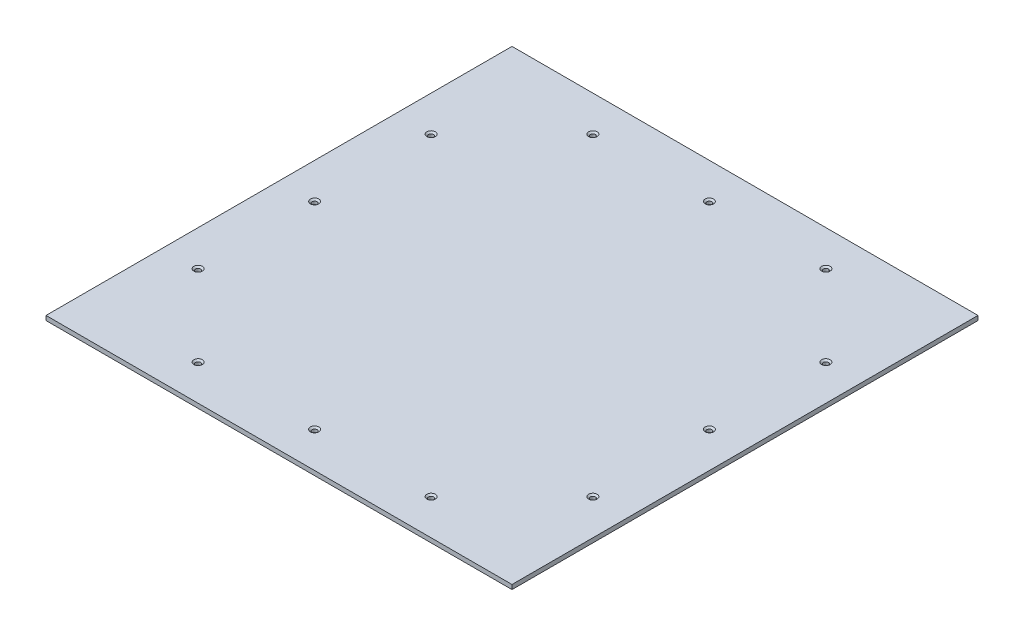
ISO-10303-21;
HEADER;
FILE_DESCRIPTION(('STEP AP214'),'2;1');
FILE_NAME('part.step','',(''),(''),'','','');
FILE_SCHEMA(('AUTOMOTIVE_DESIGN { 1 0 10303 214 1 1 1 1 }'));
ENDSEC;
DATA;
#1=APPLICATION_CONTEXT('core data for automotive mechanical design processes');
#2=APPLICATION_PROTOCOL_DEFINITION('international standard','automotive_design',2000,#1);
#3=PRODUCT_CONTEXT('',#1,'mechanical');
#4=PRODUCT('Part','Part','',(#3));
#5=PRODUCT_RELATED_PRODUCT_CATEGORY('part','',(#4));
#6=PRODUCT_DEFINITION_FORMATION('','',#4);
#7=PRODUCT_DEFINITION_CONTEXT('part definition',#1,'design');
#8=PRODUCT_DEFINITION('design','',#6,#7);
#9=PRODUCT_DEFINITION_SHAPE('','',#8);
#10=(LENGTH_UNIT() NAMED_UNIT(*) SI_UNIT(.MILLI.,.METRE.));
#11=(NAMED_UNIT(*) PLANE_ANGLE_UNIT() SI_UNIT($,.RADIAN.));
#12=(NAMED_UNIT(*) SI_UNIT($,.STERADIAN.) SOLID_ANGLE_UNIT());
#13=UNCERTAINTY_MEASURE_WITH_UNIT(LENGTH_MEASURE(1.E-05),#10,'distance_accuracy_value','');
#14=(GEOMETRIC_REPRESENTATION_CONTEXT(3) GLOBAL_UNCERTAINTY_ASSIGNED_CONTEXT((#13)) GLOBAL_UNIT_ASSIGNED_CONTEXT((#10,
#11,#12)) REPRESENTATION_CONTEXT('',''));
#15=CARTESIAN_POINT('',(0.,0.,0.));
#16=DIRECTION('',(0.,0.,1.));
#17=DIRECTION('',(1.,0.,0.));
#18=AXIS2_PLACEMENT_3D('',#15,#16,#17);
#19=CARTESIAN_POINT('',(83.101307,94.213807,83.101307));
#20=DIRECTION('',(1.,0.,0.));
#21=DIRECTION('',(0.,0.,1.));
#22=AXIS2_PLACEMENT_3D('',#19,#20,#21);
#23=PLANE('',#22);
#24=DIRECTION('',(0.,0.,1.));
#25=VECTOR('',#24,1.);
#26=CARTESIAN_POINT('',(83.101307,92.626307,83.101307));
#27=LINE('',#26,#25);
#28=CARTESIAN_POINT('',(83.101307,92.626307,-83.101307));
#29=VERTEX_POINT('',#28);
#30=CARTESIAN_POINT('',(83.101307,92.626307,83.101307));
#31=VERTEX_POINT('',#30);
#32=EDGE_CURVE('E81',#29,#31,#27,.T.);
#33=ORIENTED_EDGE('',*,*,#32,.F.);
#34=DIRECTION('',(0.,-1.,0.));
#35=VECTOR('',#34,1.);
#36=CARTESIAN_POINT('',(83.101307,94.213807,-83.101307));
#37=LINE('',#36,#35);
#38=CARTESIAN_POINT('',(83.101307,94.213807,-83.101307));
#39=VERTEX_POINT('',#38);
#40=EDGE_CURVE('E11',#39,#29,#37,.T.);
#41=ORIENTED_EDGE('',*,*,#40,.F.);
#42=DIRECTION('',(0.,0.,1.));
#43=VECTOR('',#42,1.);
#44=CARTESIAN_POINT('',(83.101307,94.213807,83.101307));
#45=LINE('',#44,#43);
#46=CARTESIAN_POINT('',(83.101307,94.213807,83.101307));
#47=VERTEX_POINT('',#46);
#48=EDGE_CURVE('E74',#39,#47,#45,.T.);
#49=ORIENTED_EDGE('',*,*,#48,.T.);
#50=DIRECTION('',(0.,-1.,0.));
#51=VECTOR('',#50,1.);
#52=CARTESIAN_POINT('',(83.101307,94.213807,83.101307));
#53=LINE('',#52,#51);
#54=EDGE_CURVE('E19',#47,#31,#53,.T.);
#55=ORIENTED_EDGE('',*,*,#54,.T.);
#56=EDGE_LOOP('',(#33,#41,#49,#55));
#57=FACE_BOUND('',#56,.T.);
#58=ADVANCED_FACE('F16',(#57),#23,.T.);
#59=CARTESIAN_POINT('',(83.101307,94.213807,-83.101307));
#60=DIRECTION('',(0.,0.,-1.));
#61=DIRECTION('',(1.,0.,0.));
#62=AXIS2_PLACEMENT_3D('',#59,#60,#61);
#63=PLANE('',#62);
#64=DIRECTION('',(1.,0.,0.));
#65=VECTOR('',#64,1.);
#66=CARTESIAN_POINT('',(83.101307,92.626307,-83.101307));
#67=LINE('',#66,#65);
#68=CARTESIAN_POINT('',(-83.101307,92.626307,-83.101307));
#69=VERTEX_POINT('',#68);
#70=EDGE_CURVE('E76',#69,#29,#67,.T.);
#71=ORIENTED_EDGE('',*,*,#70,.F.);
#72=DIRECTION('',(0.,-1.,0.));
#73=VECTOR('',#72,1.);
#74=CARTESIAN_POINT('',(-83.101307,94.213807,-83.101307));
#75=LINE('',#74,#73);
#76=CARTESIAN_POINT('',(-83.101307,94.213807,-83.101307));
#77=VERTEX_POINT('',#76);
#78=EDGE_CURVE('E25',#77,#69,#75,.T.);
#79=ORIENTED_EDGE('',*,*,#78,.F.);
#80=DIRECTION('',(1.,0.,0.));
#81=VECTOR('',#80,1.);
#82=CARTESIAN_POINT('',(83.101307,94.213807,-83.101307));
#83=LINE('',#82,#81);
#84=EDGE_CURVE('E71',#77,#39,#83,.T.);
#85=ORIENTED_EDGE('',*,*,#84,.T.);
#86=ORIENTED_EDGE('',*,*,#40,.T.);
#87=EDGE_LOOP('',(#71,#79,#85,#86));
#88=FACE_BOUND('',#87,.T.);
#89=ADVANCED_FACE('F92',(#88),#63,.T.);
#90=CARTESIAN_POINT('',(-83.101307,94.213807,83.101307));
#91=DIRECTION('',(-1.,0.,0.));
#92=DIRECTION('',(0.,0.,-1.));
#93=AXIS2_PLACEMENT_3D('',#90,#91,#92);
#94=PLANE('',#93);
#95=DIRECTION('',(0.,0.,-1.));
#96=VECTOR('',#95,1.);
#97=CARTESIAN_POINT('',(-83.101307,92.626307,83.101307));
#98=LINE('',#97,#96);
#99=CARTESIAN_POINT('',(-83.101307,92.626307,83.101307));
#100=VERTEX_POINT('',#99);
#101=EDGE_CURVE('E66',#100,#69,#98,.T.);
#102=ORIENTED_EDGE('',*,*,#101,.F.);
#103=DIRECTION('',(0.,-1.,0.));
#104=VECTOR('',#103,1.);
#105=CARTESIAN_POINT('',(-83.101307,94.213807,83.101307));
#106=LINE('',#105,#104);
#107=CARTESIAN_POINT('',(-83.101307,94.213807,83.101307));
#108=VERTEX_POINT('',#107);
#109=EDGE_CURVE('E61',#108,#100,#106,.T.);
#110=ORIENTED_EDGE('',*,*,#109,.F.);
#111=DIRECTION('',(0.,0.,-1.));
#112=VECTOR('',#111,1.);
#113=CARTESIAN_POINT('',(-83.101307,94.213807,83.101307));
#114=LINE('',#113,#112);
#115=EDGE_CURVE('E64',#108,#77,#114,.T.);
#116=ORIENTED_EDGE('',*,*,#115,.T.);
#117=ORIENTED_EDGE('',*,*,#78,.T.);
#118=EDGE_LOOP('',(#102,#110,#116,#117));
#119=FACE_BOUND('',#118,.T.);
#120=ADVANCED_FACE('F63',(#119),#94,.T.);
#121=CARTESIAN_POINT('',(83.101307,94.213807,83.101307));
#122=DIRECTION('',(0.,0.,1.));
#123=DIRECTION('',(-1.,0.,0.));
#124=AXIS2_PLACEMENT_3D('',#121,#122,#123);
#125=PLANE('',#124);
#126=DIRECTION('',(-1.,0.,0.));
#127=VECTOR('',#126,1.);
#128=CARTESIAN_POINT('',(83.101307,92.626307,83.101307));
#129=LINE('',#128,#127);
#130=EDGE_CURVE('E84',#31,#100,#129,.T.);
#131=ORIENTED_EDGE('',*,*,#130,.F.);
#132=ORIENTED_EDGE('',*,*,#54,.F.);
#133=DIRECTION('',(-1.,0.,0.));
#134=VECTOR('',#133,1.);
#135=CARTESIAN_POINT('',(83.101307,94.213807,83.101307));
#136=LINE('',#135,#134);
#137=EDGE_CURVE('E70',#47,#108,#136,.T.);
#138=ORIENTED_EDGE('',*,*,#137,.T.);
#139=ORIENTED_EDGE('',*,*,#109,.T.);
#140=EDGE_LOOP('',(#131,#132,#138,#139));
#141=FACE_BOUND('',#140,.T.);
#142=ADVANCED_FACE('F73',(#141),#125,.T.);
#143=CARTESIAN_POINT('',(83.101307,94.213807,-83.101307));
#144=DIRECTION('',(0.,1.,0.));
#145=DIRECTION('',(0.,0.,-1.));
#146=AXIS2_PLACEMENT_3D('',#143,#144,#145);
#147=PLANE('',#146);
#148=CARTESIAN_POINT('',(-70.4013070000004,94.213807,41.5506534999993));
#149=DIRECTION('',(0.,1.,0.));
#150=DIRECTION('',(0.,0.,-1.));
#151=AXIS2_PLACEMENT_3D('',#148,#149,#150);
#152=CIRCLE('',#151,1.51130000000001);
#153=CARTESIAN_POINT('',(-70.4013070000004,94.213807,40.0393534999993));
#154=VERTEX_POINT('',#153);
#155=EDGE_CURVE('E221',#154,#154,#152,.T.);
#156=ORIENTED_EDGE('',*,*,#155,.F.);
#157=EDGE_LOOP('',(#156));
#158=FACE_BOUND('',#157,.T.);
#159=CARTESIAN_POINT('',(-70.401307,94.213807,-7.26677097100821E-13));
#160=DIRECTION('',(0.,1.,0.));
#161=DIRECTION('',(0.,0.,-1.));
#162=AXIS2_PLACEMENT_3D('',#159,#160,#161);
#163=CIRCLE('',#162,1.51129999999999);
#164=CARTESIAN_POINT('',(-70.401307,94.213807,-1.51130000000072));
#165=VERTEX_POINT('',#164);
#166=EDGE_CURVE('E228',#165,#165,#163,.T.);
#167=ORIENTED_EDGE('',*,*,#166,.F.);
#168=EDGE_LOOP('',(#167));
#169=FACE_BOUND('',#168,.T.);
#170=CARTESIAN_POINT('',(-70.4013069999996,94.213807,-41.5506535000007));
#171=DIRECTION('',(0.,1.,0.));
#172=DIRECTION('',(0.,0.,-1.));
#173=AXIS2_PLACEMENT_3D('',#170,#171,#172);
#174=CIRCLE('',#173,1.51129999999999);
#175=CARTESIAN_POINT('',(-70.4013069999996,94.213807,-43.0619535000007));
#176=VERTEX_POINT('',#175);
#177=EDGE_CURVE('E237',#176,#176,#174,.T.);
#178=ORIENTED_EDGE('',*,*,#177,.F.);
#179=EDGE_LOOP('',(#178));
#180=FACE_BOUND('',#179,.T.);
#181=CARTESIAN_POINT('',(41.5506534999995,94.213807,70.4013070000003));
#182=DIRECTION('',(0.,1.,0.));
#183=DIRECTION('',(0.,0.,-1.));
#184=AXIS2_PLACEMENT_3D('',#181,#182,#183);
#185=CIRCLE('',#184,1.5113);
#186=CARTESIAN_POINT('',(41.5506534999995,94.213807,68.8900070000003));
#187=VERTEX_POINT('',#186);
#188=EDGE_CURVE('E246',#187,#187,#185,.T.);
#189=ORIENTED_EDGE('',*,*,#188,.F.);
#190=EDGE_LOOP('',(#189));
#191=FACE_BOUND('',#190,.T.);
#192=CARTESIAN_POINT('',(-4.80872105109967E-13,94.213807,70.401307));
#193=DIRECTION('',(0.,1.,0.));
#194=DIRECTION('',(0.,0.,-1.));
#195=AXIS2_PLACEMENT_3D('',#192,#193,#194);
#196=CIRCLE('',#195,1.5113);
#197=CARTESIAN_POINT('',(-4.80872105109967E-13,94.213807,68.890007));
#198=VERTEX_POINT('',#197);
#199=EDGE_CURVE('E255',#198,#198,#196,.T.);
#200=ORIENTED_EDGE('',*,*,#199,.F.);
#201=EDGE_LOOP('',(#200));
#202=FACE_BOUND('',#201,.T.);
#203=CARTESIAN_POINT('',(-41.5506535000005,94.213807,70.4013069999997));
#204=DIRECTION('',(0.,1.,0.));
#205=DIRECTION('',(0.,0.,-1.));
#206=AXIS2_PLACEMENT_3D('',#203,#204,#205);
#207=CIRCLE('',#206,1.5113);
#208=CARTESIAN_POINT('',(-41.5506535000005,94.213807,68.8900069999997));
#209=VERTEX_POINT('',#208);
#210=EDGE_CURVE('E264',#209,#209,#207,.T.);
#211=ORIENTED_EDGE('',*,*,#210,.F.);
#212=EDGE_LOOP('',(#211));
#213=FACE_BOUND('',#212,.T.);
#214=CARTESIAN_POINT('',(70.4013070000001,94.213807,-41.5506534999998));
#215=DIRECTION('',(0.,1.,0.));
#216=DIRECTION('',(0.,0.,-1.));
#217=AXIS2_PLACEMENT_3D('',#214,#215,#216);
#218=CIRCLE('',#217,1.51129999999999);
#219=CARTESIAN_POINT('',(70.4013070000001,94.213807,-43.0619534999998));
#220=VERTEX_POINT('',#219);
#221=EDGE_CURVE('E273',#220,#220,#218,.T.);
#222=ORIENTED_EDGE('',*,*,#221,.F.);
#223=EDGE_LOOP('',(#222));
#224=FACE_BOUND('',#223,.T.);
#225=CARTESIAN_POINT('',(70.401307,94.213807,2.35067113119114E-13));
#226=DIRECTION('',(0.,1.,0.));
#227=DIRECTION('',(0.,0.,-1.));
#228=AXIS2_PLACEMENT_3D('',#225,#226,#227);
#229=CIRCLE('',#228,1.51129999999999);
#230=CARTESIAN_POINT('',(70.401307,94.213807,-1.51129999999976));
#231=VERTEX_POINT('',#230);
#232=EDGE_CURVE('E282',#231,#231,#229,.T.);
#233=ORIENTED_EDGE('',*,*,#232,.F.);
#234=EDGE_LOOP('',(#233));
#235=FACE_BOUND('',#234,.T.);
#236=CARTESIAN_POINT('',(70.4013069999999,94.213807,41.5506535000003));
#237=DIRECTION('',(0.,1.,0.));
#238=DIRECTION('',(0.,0.,-1.));
#239=AXIS2_PLACEMENT_3D('',#236,#237,#238);
#240=CIRCLE('',#239,1.51130000000001);
#241=CARTESIAN_POINT('',(70.4013069999999,94.213807,40.0393535000002));
#242=VERTEX_POINT('',#241);
#243=EDGE_CURVE('E291',#242,#242,#240,.T.);
#244=ORIENTED_EDGE('',*,*,#243,.F.);
#245=EDGE_LOOP('',(#244));
#246=FACE_BOUND('',#245,.T.);
#247=CARTESIAN_POINT('',(-41.5506535,94.213807,-70.401307));
#248=DIRECTION('',(0.,1.,0.));
#249=DIRECTION('',(0.,0.,-1.));
#250=AXIS2_PLACEMENT_3D('',#247,#248,#249);
#251=CIRCLE('',#250,1.5113);
#252=CARTESIAN_POINT('',(-41.5506535,94.213807,-71.912607));
#253=VERTEX_POINT('',#252);
#254=EDGE_CURVE('E300',#253,#253,#251,.T.);
#255=ORIENTED_EDGE('',*,*,#254,.F.);
#256=EDGE_LOOP('',(#255));
#257=FACE_BOUND('',#256,.T.);
#258=CARTESIAN_POINT('',(0.,94.213807,-70.401307));
#259=DIRECTION('',(0.,1.,0.));
#260=DIRECTION('',(0.,0.,-1.));
#261=AXIS2_PLACEMENT_3D('',#258,#259,#260);
#262=CIRCLE('',#261,1.5113);
#263=CARTESIAN_POINT('',(0.,94.213807,-71.912607));
#264=VERTEX_POINT('',#263);
#265=EDGE_CURVE('E309',#264,#264,#262,.T.);
#266=ORIENTED_EDGE('',*,*,#265,.F.);
#267=EDGE_LOOP('',(#266));
#268=FACE_BOUND('',#267,.T.);
#269=CARTESIAN_POINT('',(41.5506535,94.213807,-70.401307));
#270=DIRECTION('',(0.,1.,0.));
#271=DIRECTION('',(0.,0.,-1.));
#272=AXIS2_PLACEMENT_3D('',#269,#270,#271);
#273=CIRCLE('',#272,1.5113);
#274=CARTESIAN_POINT('',(41.5506535,94.213807,-71.912607));
#275=VERTEX_POINT('',#274);
#276=EDGE_CURVE('E318',#275,#275,#273,.T.);
#277=ORIENTED_EDGE('',*,*,#276,.F.);
#278=EDGE_LOOP('',(#277));
#279=FACE_BOUND('',#278,.T.);
#280=ORIENTED_EDGE('',*,*,#48,.F.);
#281=ORIENTED_EDGE('',*,*,#84,.F.);
#282=ORIENTED_EDGE('',*,*,#115,.F.);
#283=ORIENTED_EDGE('',*,*,#137,.F.);
#284=EDGE_LOOP('',(#280,#281,#282,#283));
#285=FACE_BOUND('',#284,.T.);
#286=ADVANCED_FACE('F69',(#158,#169,#180,#191,#202,#213,#224,#235,#246,#257,#268,#279,#285),
#147,.T.);
#287=CARTESIAN_POINT('',(83.101307,92.626307,-83.101307));
#288=DIRECTION('',(0.,1.,0.));
#289=DIRECTION('',(0.,0.,-1.));
#290=AXIS2_PLACEMENT_3D('',#287,#288,#289);
#291=PLANE('',#290);
#292=CARTESIAN_POINT('',(-70.4013070000004,92.626307,41.5506534999993));
#293=DIRECTION('',(0.,1.,0.));
#294=DIRECTION('',(0.,0.,-1.));
#295=AXIS2_PLACEMENT_3D('',#292,#293,#294);
#296=CIRCLE('',#295,0.889000000000001);
#297=CARTESIAN_POINT('',(-70.4013070000004,92.626307,40.6616534999993));
#298=VERTEX_POINT('',#297);
#299=EDGE_CURVE('E223',#298,#298,#296,.T.);
#300=ORIENTED_EDGE('',*,*,#299,.T.);
#301=EDGE_LOOP('',(#300));
#302=FACE_BOUND('',#301,.T.);
#303=CARTESIAN_POINT('',(-70.401307,92.626307,-7.26677097100821E-13));
#304=DIRECTION('',(0.,1.,0.));
#305=DIRECTION('',(0.,0.,-1.));
#306=AXIS2_PLACEMENT_3D('',#303,#304,#305);
#307=CIRCLE('',#306,0.889000000000001);
#308=CARTESIAN_POINT('',(-70.401307,92.626307,-0.889000000000728));
#309=VERTEX_POINT('',#308);
#310=EDGE_CURVE('E234',#309,#309,#307,.T.);
#311=ORIENTED_EDGE('',*,*,#310,.T.);
#312=EDGE_LOOP('',(#311));
#313=FACE_BOUND('',#312,.T.);
#314=CARTESIAN_POINT('',(-70.4013069999996,92.626307,-41.5506535000007));
#315=DIRECTION('',(0.,1.,0.));
#316=DIRECTION('',(0.,0.,-1.));
#317=AXIS2_PLACEMENT_3D('',#314,#315,#316);
#318=CIRCLE('',#317,0.889000000000001);
#319=CARTESIAN_POINT('',(-70.4013069999996,92.626307,-42.4396535000007));
#320=VERTEX_POINT('',#319);
#321=EDGE_CURVE('E243',#320,#320,#318,.T.);
#322=ORIENTED_EDGE('',*,*,#321,.T.);
#323=EDGE_LOOP('',(#322));
#324=FACE_BOUND('',#323,.T.);
#325=CARTESIAN_POINT('',(41.5506534999995,92.626307,70.4013070000003));
#326=DIRECTION('',(0.,1.,0.));
#327=DIRECTION('',(0.,0.,-1.));
#328=AXIS2_PLACEMENT_3D('',#325,#326,#327);
#329=CIRCLE('',#328,0.889000000000001);
#330=CARTESIAN_POINT('',(41.5506534999995,92.626307,69.5123070000003));
#331=VERTEX_POINT('',#330);
#332=EDGE_CURVE('E252',#331,#331,#329,.T.);
#333=ORIENTED_EDGE('',*,*,#332,.T.);
#334=EDGE_LOOP('',(#333));
#335=FACE_BOUND('',#334,.T.);
#336=CARTESIAN_POINT('',(-4.80872105109967E-13,92.626307,70.401307));
#337=DIRECTION('',(0.,1.,0.));
#338=DIRECTION('',(0.,0.,-1.));
#339=AXIS2_PLACEMENT_3D('',#336,#337,#338);
#340=CIRCLE('',#339,0.889);
#341=CARTESIAN_POINT('',(-4.80872105109967E-13,92.626307,69.512307));
#342=VERTEX_POINT('',#341);
#343=EDGE_CURVE('E261',#342,#342,#340,.T.);
#344=ORIENTED_EDGE('',*,*,#343,.T.);
#345=EDGE_LOOP('',(#344));
#346=FACE_BOUND('',#345,.T.);
#347=CARTESIAN_POINT('',(-41.5506535000005,92.626307,70.4013069999997));
#348=DIRECTION('',(0.,1.,0.));
#349=DIRECTION('',(0.,0.,-1.));
#350=AXIS2_PLACEMENT_3D('',#347,#348,#349);
#351=CIRCLE('',#350,0.889000000000001);
#352=CARTESIAN_POINT('',(-41.5506535000005,92.626307,69.5123069999997));
#353=VERTEX_POINT('',#352);
#354=EDGE_CURVE('E270',#353,#353,#351,.T.);
#355=ORIENTED_EDGE('',*,*,#354,.T.);
#356=EDGE_LOOP('',(#355));
#357=FACE_BOUND('',#356,.T.);
#358=CARTESIAN_POINT('',(70.4013070000001,92.626307,-41.5506534999998));
#359=DIRECTION('',(0.,1.,0.));
#360=DIRECTION('',(0.,0.,-1.));
#361=AXIS2_PLACEMENT_3D('',#358,#359,#360);
#362=CIRCLE('',#361,0.889000000000001);
#363=CARTESIAN_POINT('',(70.4013070000001,92.626307,-42.4396534999998));
#364=VERTEX_POINT('',#363);
#365=EDGE_CURVE('E279',#364,#364,#362,.T.);
#366=ORIENTED_EDGE('',*,*,#365,.T.);
#367=EDGE_LOOP('',(#366));
#368=FACE_BOUND('',#367,.T.);
#369=CARTESIAN_POINT('',(70.401307,92.626307,2.35067113119114E-13));
#370=DIRECTION('',(0.,1.,0.));
#371=DIRECTION('',(0.,0.,-1.));
#372=AXIS2_PLACEMENT_3D('',#369,#370,#371);
#373=CIRCLE('',#372,0.889000000000001);
#374=CARTESIAN_POINT('',(70.401307,92.626307,-0.888999999999766));
#375=VERTEX_POINT('',#374);
#376=EDGE_CURVE('E288',#375,#375,#373,.T.);
#377=ORIENTED_EDGE('',*,*,#376,.T.);
#378=EDGE_LOOP('',(#377));
#379=FACE_BOUND('',#378,.T.);
#380=CARTESIAN_POINT('',(70.4013069999999,92.626307,41.5506535000003));
#381=DIRECTION('',(0.,1.,0.));
#382=DIRECTION('',(0.,0.,-1.));
#383=AXIS2_PLACEMENT_3D('',#380,#381,#382);
#384=CIRCLE('',#383,0.889000000000001);
#385=CARTESIAN_POINT('',(70.4013069999999,92.626307,40.6616535000002));
#386=VERTEX_POINT('',#385);
#387=EDGE_CURVE('E297',#386,#386,#384,.T.);
#388=ORIENTED_EDGE('',*,*,#387,.T.);
#389=EDGE_LOOP('',(#388));
#390=FACE_BOUND('',#389,.T.);
#391=CARTESIAN_POINT('',(-41.5506535,92.626307,-70.401307));
#392=DIRECTION('',(0.,1.,0.));
#393=DIRECTION('',(0.,0.,-1.));
#394=AXIS2_PLACEMENT_3D('',#391,#392,#393);
#395=CIRCLE('',#394,0.889000000000001);
#396=CARTESIAN_POINT('',(-41.5506535,92.626307,-71.290307));
#397=VERTEX_POINT('',#396);
#398=EDGE_CURVE('E306',#397,#397,#395,.T.);
#399=ORIENTED_EDGE('',*,*,#398,.T.);
#400=EDGE_LOOP('',(#399));
#401=FACE_BOUND('',#400,.T.);
#402=CARTESIAN_POINT('',(0.,92.626307,-70.401307));
#403=DIRECTION('',(0.,1.,0.));
#404=DIRECTION('',(0.,0.,-1.));
#405=AXIS2_PLACEMENT_3D('',#402,#403,#404);
#406=CIRCLE('',#405,0.889);
#407=CARTESIAN_POINT('',(0.,92.626307,-71.290307));
#408=VERTEX_POINT('',#407);
#409=EDGE_CURVE('E315',#408,#408,#406,.T.);
#410=ORIENTED_EDGE('',*,*,#409,.T.);
#411=EDGE_LOOP('',(#410));
#412=FACE_BOUND('',#411,.T.);
#413=CARTESIAN_POINT('',(41.5506535,92.626307,-70.401307));
#414=DIRECTION('',(0.,1.,0.));
#415=DIRECTION('',(0.,0.,-1.));
#416=AXIS2_PLACEMENT_3D('',#413,#414,#415);
#417=CIRCLE('',#416,0.889000000000001);
#418=CARTESIAN_POINT('',(41.5506535,92.626307,-71.290307));
#419=VERTEX_POINT('',#418);
#420=EDGE_CURVE('E85',#419,#419,#417,.T.);
#421=ORIENTED_EDGE('',*,*,#420,.T.);
#422=EDGE_LOOP('',(#421));
#423=FACE_BOUND('',#422,.T.);
#424=ORIENTED_EDGE('',*,*,#32,.T.);
#425=ORIENTED_EDGE('',*,*,#130,.T.);
#426=ORIENTED_EDGE('',*,*,#101,.T.);
#427=ORIENTED_EDGE('',*,*,#70,.T.);
#428=EDGE_LOOP('',(#424,#425,#426,#427));
#429=FACE_BOUND('',#428,.T.);
#430=ADVANCED_FACE('F91',(#302,#313,#324,#335,#346,#357,#368,#379,#390,#401,#412,#423,#429),
#291,.F.);
#431=CARTESIAN_POINT('',(41.5506535,94.213807,-70.401307));
#432=DIRECTION('',(0.,1.,0.));
#433=DIRECTION('',(0.,0.,-1.));
#434=AXIS2_PLACEMENT_3D('',#431,#432,#433);
#435=CYLINDRICAL_SURFACE('',#434,0.888999999999997);
#436=ORIENTED_EDGE('',*,*,#420,.F.);
#437=EDGE_LOOP('',(#436));
#438=FACE_BOUND('',#437,.T.);
#439=CARTESIAN_POINT('',(41.5506535,93.6916352995184,-70.401307));
#440=DIRECTION('',(0.,1.,0.));
#441=DIRECTION('',(0.,0.,-1.));
#442=AXIS2_PLACEMENT_3D('',#439,#440,#441);
#443=CIRCLE('',#442,0.888999999999994);
#444=CARTESIAN_POINT('',(41.5506535,93.6916352995184,-71.290307));
#445=VERTEX_POINT('',#444);
#446=EDGE_CURVE('E321',#445,#445,#443,.T.);
#447=ORIENTED_EDGE('',*,*,#446,.T.);
#448=EDGE_LOOP('',(#447));
#449=FACE_BOUND('',#448,.T.);
#450=ADVANCED_FACE('F114',(#438,#449),#435,.F.);
#451=CARTESIAN_POINT('',(41.5506535,94.213807,-70.401307));
#452=DIRECTION('',(0.,1.,0.));
#453=DIRECTION('',(0.,0.,-1.));
#454=AXIS2_PLACEMENT_3D('',#451,#452,#453);
#455=CONICAL_SURFACE('',#454,1.5113,0.872664625997172);
#456=ORIENTED_EDGE('',*,*,#446,.F.);
#457=EDGE_LOOP('',(#456));
#458=FACE_BOUND('',#457,.T.);
#459=ORIENTED_EDGE('',*,*,#276,.T.);
#460=EDGE_LOOP('',(#459));
#461=FACE_BOUND('',#460,.T.);
#462=ADVANCED_FACE('F121',(#458,#461),#455,.F.);
#463=CARTESIAN_POINT('',(0.,94.213807,-70.401307));
#464=DIRECTION('',(0.,1.,0.));
#465=DIRECTION('',(0.,0.,-1.));
#466=AXIS2_PLACEMENT_3D('',#463,#464,#465);
#467=CYLINDRICAL_SURFACE('',#466,0.888999999999998);
#468=ORIENTED_EDGE('',*,*,#409,.F.);
#469=EDGE_LOOP('',(#468));
#470=FACE_BOUND('',#469,.T.);
#471=CARTESIAN_POINT('',(0.,93.6916352995184,-70.401307));
#472=DIRECTION('',(0.,1.,0.));
#473=DIRECTION('',(0.,0.,-1.));
#474=AXIS2_PLACEMENT_3D('',#471,#472,#473);
#475=CIRCLE('',#474,0.888999999999997);
#476=CARTESIAN_POINT('',(0.,93.6916352995184,-71.290307));
#477=VERTEX_POINT('',#476);
#478=EDGE_CURVE('E312',#477,#477,#475,.T.);
#479=ORIENTED_EDGE('',*,*,#478,.T.);
#480=EDGE_LOOP('',(#479));
#481=FACE_BOUND('',#480,.T.);
#482=ADVANCED_FACE('F125',(#470,#481),#467,.F.);
#483=CARTESIAN_POINT('',(0.,94.213807,-70.401307));
#484=DIRECTION('',(0.,1.,0.));
#485=DIRECTION('',(0.,0.,-1.));
#486=AXIS2_PLACEMENT_3D('',#483,#484,#485);
#487=CONICAL_SURFACE('',#486,1.5113,0.87266462599717);
#488=ORIENTED_EDGE('',*,*,#478,.F.);
#489=EDGE_LOOP('',(#488));
#490=FACE_BOUND('',#489,.T.);
#491=ORIENTED_EDGE('',*,*,#265,.T.);
#492=EDGE_LOOP('',(#491));
#493=FACE_BOUND('',#492,.T.);
#494=ADVANCED_FACE('F129',(#490,#493),#487,.F.);
#495=CARTESIAN_POINT('',(-41.5506535,94.213807,-70.401307));
#496=DIRECTION('',(0.,1.,0.));
#497=DIRECTION('',(0.,0.,-1.));
#498=AXIS2_PLACEMENT_3D('',#495,#496,#497);
#499=CYLINDRICAL_SURFACE('',#498,0.888999999999997);
#500=ORIENTED_EDGE('',*,*,#398,.F.);
#501=EDGE_LOOP('',(#500));
#502=FACE_BOUND('',#501,.T.);
#503=CARTESIAN_POINT('',(-41.5506535,93.6916352995184,-70.401307));
#504=DIRECTION('',(0.,1.,0.));
#505=DIRECTION('',(0.,0.,-1.));
#506=AXIS2_PLACEMENT_3D('',#503,#504,#505);
#507=CIRCLE('',#506,0.888999999999994);
#508=CARTESIAN_POINT('',(-41.5506535,93.6916352995184,-71.290307));
#509=VERTEX_POINT('',#508);
#510=EDGE_CURVE('E303',#509,#509,#507,.T.);
#511=ORIENTED_EDGE('',*,*,#510,.T.);
#512=EDGE_LOOP('',(#511));
#513=FACE_BOUND('',#512,.T.);
#514=ADVANCED_FACE('F133',(#502,#513),#499,.F.);
#515=CARTESIAN_POINT('',(-41.5506535,94.213807,-70.401307));
#516=DIRECTION('',(0.,1.,0.));
#517=DIRECTION('',(0.,0.,-1.));
#518=AXIS2_PLACEMENT_3D('',#515,#516,#517);
#519=CONICAL_SURFACE('',#518,1.5113,0.872664625997172);
#520=ORIENTED_EDGE('',*,*,#510,.F.);
#521=EDGE_LOOP('',(#520));
#522=FACE_BOUND('',#521,.T.);
#523=ORIENTED_EDGE('',*,*,#254,.T.);
#524=EDGE_LOOP('',(#523));
#525=FACE_BOUND('',#524,.T.);
#526=ADVANCED_FACE('F137',(#522,#525),#519,.F.);
#527=CARTESIAN_POINT('',(70.4013069999999,94.213807,41.5506535000003));
#528=DIRECTION('',(0.,1.,0.));
#529=DIRECTION('',(0.,0.,-1.));
#530=AXIS2_PLACEMENT_3D('',#527,#528,#529);
#531=CYLINDRICAL_SURFACE('',#530,0.889000000000001);
#532=ORIENTED_EDGE('',*,*,#387,.F.);
#533=EDGE_LOOP('',(#532));
#534=FACE_BOUND('',#533,.T.);
#535=CARTESIAN_POINT('',(70.4013069999999,93.6916352995184,41.5506535000003));
#536=DIRECTION('',(0.,1.,0.));
#537=DIRECTION('',(0.,0.,-1.));
#538=AXIS2_PLACEMENT_3D('',#535,#536,#537);
#539=CIRCLE('',#538,0.889000000000001);
#540=CARTESIAN_POINT('',(70.4013069999999,93.6916352995184,40.6616535000002));
#541=VERTEX_POINT('',#540);
#542=EDGE_CURVE('E294',#541,#541,#539,.T.);
#543=ORIENTED_EDGE('',*,*,#542,.T.);
#544=EDGE_LOOP('',(#543));
#545=FACE_BOUND('',#544,.T.);
#546=ADVANCED_FACE('F141',(#534,#545),#531,.F.);
#547=CARTESIAN_POINT('',(70.4013069999999,94.213807,41.5506535000003));
#548=DIRECTION('',(0.,1.,0.));
#549=DIRECTION('',(0.,0.,-1.));
#550=AXIS2_PLACEMENT_3D('',#547,#548,#549);
#551=CONICAL_SURFACE('',#550,1.51130000000001,0.872664625997172);
#552=ORIENTED_EDGE('',*,*,#542,.F.);
#553=EDGE_LOOP('',(#552));
#554=FACE_BOUND('',#553,.T.);
#555=ORIENTED_EDGE('',*,*,#243,.T.);
#556=EDGE_LOOP('',(#555));
#557=FACE_BOUND('',#556,.T.);
#558=ADVANCED_FACE('F145',(#554,#557),#551,.F.);
#559=CARTESIAN_POINT('',(70.401307,94.213807,2.35067113119114E-13));
#560=DIRECTION('',(0.,1.,0.));
#561=DIRECTION('',(0.,0.,-1.));
#562=AXIS2_PLACEMENT_3D('',#559,#560,#561);
#563=CYLINDRICAL_SURFACE('',#562,0.889000000000001);
#564=ORIENTED_EDGE('',*,*,#376,.F.);
#565=EDGE_LOOP('',(#564));
#566=FACE_BOUND('',#565,.T.);
#567=CARTESIAN_POINT('',(70.401307,93.6916352995184,2.35067113119114E-13));
#568=DIRECTION('',(0.,1.,0.));
#569=DIRECTION('',(0.,0.,-1.));
#570=AXIS2_PLACEMENT_3D('',#567,#568,#569);
#571=CIRCLE('',#570,0.889000000000001);
#572=CARTESIAN_POINT('',(70.401307,93.6916352995184,-0.888999999999766));
#573=VERTEX_POINT('',#572);
#574=EDGE_CURVE('E285',#573,#573,#571,.T.);
#575=ORIENTED_EDGE('',*,*,#574,.T.);
#576=EDGE_LOOP('',(#575));
#577=FACE_BOUND('',#576,.T.);
#578=ADVANCED_FACE('F149',(#566,#577),#563,.F.);
#579=CARTESIAN_POINT('',(70.401307,94.213807,2.35067113119114E-13));
#580=DIRECTION('',(0.,1.,0.));
#581=DIRECTION('',(0.,0.,-1.));
#582=AXIS2_PLACEMENT_3D('',#579,#580,#581);
#583=CONICAL_SURFACE('',#582,1.51129999999999,0.872664625997161);
#584=ORIENTED_EDGE('',*,*,#574,.F.);
#585=EDGE_LOOP('',(#584));
#586=FACE_BOUND('',#585,.T.);
#587=ORIENTED_EDGE('',*,*,#232,.T.);
#588=EDGE_LOOP('',(#587));
#589=FACE_BOUND('',#588,.T.);
#590=ADVANCED_FACE('F153',(#586,#589),#583,.F.);
#591=CARTESIAN_POINT('',(70.4013070000001,94.213807,-41.5506534999998));
#592=DIRECTION('',(0.,1.,0.));
#593=DIRECTION('',(0.,0.,-1.));
#594=AXIS2_PLACEMENT_3D('',#591,#592,#593);
#595=CYLINDRICAL_SURFACE('',#594,0.889000000000001);
#596=ORIENTED_EDGE('',*,*,#365,.F.);
#597=EDGE_LOOP('',(#596));
#598=FACE_BOUND('',#597,.T.);
#599=CARTESIAN_POINT('',(70.4013070000001,93.6916352995184,-41.5506534999998));
#600=DIRECTION('',(0.,1.,0.));
#601=DIRECTION('',(0.,0.,-1.));
#602=AXIS2_PLACEMENT_3D('',#599,#600,#601);
#603=CIRCLE('',#602,0.889000000000001);
#604=CARTESIAN_POINT('',(70.4013070000001,93.6916352995184,-42.4396534999998));
#605=VERTEX_POINT('',#604);
#606=EDGE_CURVE('E276',#605,#605,#603,.T.);
#607=ORIENTED_EDGE('',*,*,#606,.T.);
#608=EDGE_LOOP('',(#607));
#609=FACE_BOUND('',#608,.T.);
#610=ADVANCED_FACE('F157',(#598,#609),#595,.F.);
#611=CARTESIAN_POINT('',(70.4013070000001,94.213807,-41.5506534999998));
#612=DIRECTION('',(0.,1.,0.));
#613=DIRECTION('',(0.,0.,-1.));
#614=AXIS2_PLACEMENT_3D('',#611,#612,#613);
#615=CONICAL_SURFACE('',#614,1.51129999999999,0.872664625997161);
#616=ORIENTED_EDGE('',*,*,#606,.F.);
#617=EDGE_LOOP('',(#616));
#618=FACE_BOUND('',#617,.T.);
#619=ORIENTED_EDGE('',*,*,#221,.T.);
#620=EDGE_LOOP('',(#619));
#621=FACE_BOUND('',#620,.T.);
#622=ADVANCED_FACE('F161',(#618,#621),#615,.F.);
#623=CARTESIAN_POINT('',(-41.5506535000005,94.213807,70.4013069999997));
#624=DIRECTION('',(0.,1.,0.));
#625=DIRECTION('',(0.,0.,-1.));
#626=AXIS2_PLACEMENT_3D('',#623,#624,#625);
#627=CYLINDRICAL_SURFACE('',#626,0.888999999999997);
#628=ORIENTED_EDGE('',*,*,#354,.F.);
#629=EDGE_LOOP('',(#628));
#630=FACE_BOUND('',#629,.T.);
#631=CARTESIAN_POINT('',(-41.5506535000005,93.6916352995184,70.4013069999997));
#632=DIRECTION('',(0.,1.,0.));
#633=DIRECTION('',(0.,0.,-1.));
#634=AXIS2_PLACEMENT_3D('',#631,#632,#633);
#635=CIRCLE('',#634,0.888999999999994);
#636=CARTESIAN_POINT('',(-41.5506535000005,93.6916352995184,69.5123069999997));
#637=VERTEX_POINT('',#636);
#638=EDGE_CURVE('E267',#637,#637,#635,.T.);
#639=ORIENTED_EDGE('',*,*,#638,.T.);
#640=EDGE_LOOP('',(#639));
#641=FACE_BOUND('',#640,.T.);
#642=ADVANCED_FACE('F165',(#630,#641),#627,.F.);
#643=CARTESIAN_POINT('',(-41.5506535000005,94.213807,70.4013069999997));
#644=DIRECTION('',(0.,1.,0.));
#645=DIRECTION('',(0.,0.,-1.));
#646=AXIS2_PLACEMENT_3D('',#643,#644,#645);
#647=CONICAL_SURFACE('',#646,1.5113,0.872664625997172);
#648=ORIENTED_EDGE('',*,*,#638,.F.);
#649=EDGE_LOOP('',(#648));
#650=FACE_BOUND('',#649,.T.);
#651=ORIENTED_EDGE('',*,*,#210,.T.);
#652=EDGE_LOOP('',(#651));
#653=FACE_BOUND('',#652,.T.);
#654=ADVANCED_FACE('F169',(#650,#653),#647,.F.);
#655=CARTESIAN_POINT('',(-4.80872105109967E-13,94.213807,70.401307));
#656=DIRECTION('',(0.,1.,0.));
#657=DIRECTION('',(0.,0.,-1.));
#658=AXIS2_PLACEMENT_3D('',#655,#656,#657);
#659=CYLINDRICAL_SURFACE('',#658,0.888999999999998);
#660=ORIENTED_EDGE('',*,*,#343,.F.);
#661=EDGE_LOOP('',(#660));
#662=FACE_BOUND('',#661,.T.);
#663=CARTESIAN_POINT('',(-4.80872105109967E-13,93.6916352995184,70.401307));
#664=DIRECTION('',(0.,1.,0.));
#665=DIRECTION('',(0.,0.,-1.));
#666=AXIS2_PLACEMENT_3D('',#663,#664,#665);
#667=CIRCLE('',#666,0.888999999999997);
#668=CARTESIAN_POINT('',(-4.80872105109967E-13,93.6916352995184,69.512307));
#669=VERTEX_POINT('',#668);
#670=EDGE_CURVE('E258',#669,#669,#667,.T.);
#671=ORIENTED_EDGE('',*,*,#670,.T.);
#672=EDGE_LOOP('',(#671));
#673=FACE_BOUND('',#672,.T.);
#674=ADVANCED_FACE('F173',(#662,#673),#659,.F.);
#675=CARTESIAN_POINT('',(-4.80872105109967E-13,94.213807,70.401307));
#676=DIRECTION('',(0.,1.,0.));
#677=DIRECTION('',(0.,0.,-1.));
#678=AXIS2_PLACEMENT_3D('',#675,#676,#677);
#679=CONICAL_SURFACE('',#678,1.5113,0.87266462599717);
#680=ORIENTED_EDGE('',*,*,#670,.F.);
#681=EDGE_LOOP('',(#680));
#682=FACE_BOUND('',#681,.T.);
#683=ORIENTED_EDGE('',*,*,#199,.T.);
#684=EDGE_LOOP('',(#683));
#685=FACE_BOUND('',#684,.T.);
#686=ADVANCED_FACE('F177',(#682,#685),#679,.F.);
#687=CARTESIAN_POINT('',(41.5506534999995,94.213807,70.4013070000003));
#688=DIRECTION('',(0.,1.,0.));
#689=DIRECTION('',(0.,0.,-1.));
#690=AXIS2_PLACEMENT_3D('',#687,#688,#689);
#691=CYLINDRICAL_SURFACE('',#690,0.888999999999997);
#692=ORIENTED_EDGE('',*,*,#332,.F.);
#693=EDGE_LOOP('',(#692));
#694=FACE_BOUND('',#693,.T.);
#695=CARTESIAN_POINT('',(41.5506534999995,93.6916352995184,70.4013070000003));
#696=DIRECTION('',(0.,1.,0.));
#697=DIRECTION('',(0.,0.,-1.));
#698=AXIS2_PLACEMENT_3D('',#695,#696,#697);
#699=CIRCLE('',#698,0.888999999999994);
#700=CARTESIAN_POINT('',(41.5506534999995,93.6916352995184,69.5123070000003));
#701=VERTEX_POINT('',#700);
#702=EDGE_CURVE('E249',#701,#701,#699,.T.);
#703=ORIENTED_EDGE('',*,*,#702,.T.);
#704=EDGE_LOOP('',(#703));
#705=FACE_BOUND('',#704,.T.);
#706=ADVANCED_FACE('F181',(#694,#705),#691,.F.);
#707=CARTESIAN_POINT('',(41.5506534999995,94.213807,70.4013070000003));
#708=DIRECTION('',(0.,1.,0.));
#709=DIRECTION('',(0.,0.,-1.));
#710=AXIS2_PLACEMENT_3D('',#707,#708,#709);
#711=CONICAL_SURFACE('',#710,1.5113,0.872664625997172);
#712=ORIENTED_EDGE('',*,*,#702,.F.);
#713=EDGE_LOOP('',(#712));
#714=FACE_BOUND('',#713,.T.);
#715=ORIENTED_EDGE('',*,*,#188,.T.);
#716=EDGE_LOOP('',(#715));
#717=FACE_BOUND('',#716,.T.);
#718=ADVANCED_FACE('F185',(#714,#717),#711,.F.);
#719=CARTESIAN_POINT('',(-70.4013069999996,94.213807,-41.5506535000007));
#720=DIRECTION('',(0.,1.,0.));
#721=DIRECTION('',(0.,0.,-1.));
#722=AXIS2_PLACEMENT_3D('',#719,#720,#721);
#723=CYLINDRICAL_SURFACE('',#722,0.889000000000001);
#724=ORIENTED_EDGE('',*,*,#321,.F.);
#725=EDGE_LOOP('',(#724));
#726=FACE_BOUND('',#725,.T.);
#727=CARTESIAN_POINT('',(-70.4013069999996,93.6916352995184,-41.5506535000007));
#728=DIRECTION('',(0.,1.,0.));
#729=DIRECTION('',(0.,0.,-1.));
#730=AXIS2_PLACEMENT_3D('',#727,#728,#729);
#731=CIRCLE('',#730,0.889000000000001);
#732=CARTESIAN_POINT('',(-70.4013069999996,93.6916352995184,-42.4396535000007));
#733=VERTEX_POINT('',#732);
#734=EDGE_CURVE('E240',#733,#733,#731,.T.);
#735=ORIENTED_EDGE('',*,*,#734,.T.);
#736=EDGE_LOOP('',(#735));
#737=FACE_BOUND('',#736,.T.);
#738=ADVANCED_FACE('F189',(#726,#737),#723,.F.);
#739=CARTESIAN_POINT('',(-70.4013069999996,94.213807,-41.5506535000007));
#740=DIRECTION('',(0.,1.,0.));
#741=DIRECTION('',(0.,0.,-1.));
#742=AXIS2_PLACEMENT_3D('',#739,#740,#741);
#743=CONICAL_SURFACE('',#742,1.51129999999999,0.872664625997161);
#744=ORIENTED_EDGE('',*,*,#734,.F.);
#745=EDGE_LOOP('',(#744));
#746=FACE_BOUND('',#745,.T.);
#747=ORIENTED_EDGE('',*,*,#177,.T.);
#748=EDGE_LOOP('',(#747));
#749=FACE_BOUND('',#748,.T.);
#750=ADVANCED_FACE('F193',(#746,#749),#743,.F.);
#751=CARTESIAN_POINT('',(-70.401307,94.213807,-7.26677097100821E-13));
#752=DIRECTION('',(0.,1.,0.));
#753=DIRECTION('',(0.,0.,-1.));
#754=AXIS2_PLACEMENT_3D('',#751,#752,#753);
#755=CYLINDRICAL_SURFACE('',#754,0.889000000000001);
#756=ORIENTED_EDGE('',*,*,#310,.F.);
#757=EDGE_LOOP('',(#756));
#758=FACE_BOUND('',#757,.T.);
#759=CARTESIAN_POINT('',(-70.401307,93.6916352995184,-7.26677097100821E-13));
#760=DIRECTION('',(0.,1.,0.));
#761=DIRECTION('',(0.,0.,-1.));
#762=AXIS2_PLACEMENT_3D('',#759,#760,#761);
#763=CIRCLE('',#762,0.889000000000001);
#764=CARTESIAN_POINT('',(-70.401307,93.6916352995184,-0.889000000000728));
#765=VERTEX_POINT('',#764);
#766=EDGE_CURVE('E231',#765,#765,#763,.T.);
#767=ORIENTED_EDGE('',*,*,#766,.T.);
#768=EDGE_LOOP('',(#767));
#769=FACE_BOUND('',#768,.T.);
#770=ADVANCED_FACE('F197',(#758,#769),#755,.F.);
#771=CARTESIAN_POINT('',(-70.401307,94.213807,-7.26677097100821E-13));
#772=DIRECTION('',(0.,1.,0.));
#773=DIRECTION('',(0.,0.,-1.));
#774=AXIS2_PLACEMENT_3D('',#771,#772,#773);
#775=CONICAL_SURFACE('',#774,1.51129999999999,0.872664625997161);
#776=ORIENTED_EDGE('',*,*,#766,.F.);
#777=EDGE_LOOP('',(#776));
#778=FACE_BOUND('',#777,.T.);
#779=ORIENTED_EDGE('',*,*,#166,.T.);
#780=EDGE_LOOP('',(#779));
#781=FACE_BOUND('',#780,.T.);
#782=ADVANCED_FACE('F201',(#778,#781),#775,.F.);
#783=CARTESIAN_POINT('',(-70.4013070000004,94.213807,41.5506534999993));
#784=DIRECTION('',(0.,1.,0.));
#785=DIRECTION('',(0.,0.,-1.));
#786=AXIS2_PLACEMENT_3D('',#783,#784,#785);
#787=CYLINDRICAL_SURFACE('',#786,0.889000000000001);
#788=ORIENTED_EDGE('',*,*,#299,.F.);
#789=EDGE_LOOP('',(#788));
#790=FACE_BOUND('',#789,.T.);
#791=CARTESIAN_POINT('',(-70.4013070000004,93.6916352995184,41.5506534999993));
#792=DIRECTION('',(0.,1.,0.));
#793=DIRECTION('',(0.,0.,-1.));
#794=AXIS2_PLACEMENT_3D('',#791,#792,#793);
#795=CIRCLE('',#794,0.889000000000001);
#796=CARTESIAN_POINT('',(-70.4013070000004,93.6916352995184,40.6616534999993));
#797=VERTEX_POINT('',#796);
#798=EDGE_CURVE('E219',#797,#797,#795,.T.);
#799=ORIENTED_EDGE('',*,*,#798,.T.);
#800=EDGE_LOOP('',(#799));
#801=FACE_BOUND('',#800,.T.);
#802=ADVANCED_FACE('F205',(#790,#801),#787,.F.);
#803=CARTESIAN_POINT('',(-70.4013070000004,94.213807,41.5506534999993));
#804=DIRECTION('',(0.,1.,0.));
#805=DIRECTION('',(0.,0.,-1.));
#806=AXIS2_PLACEMENT_3D('',#803,#804,#805);
#807=CONICAL_SURFACE('',#806,1.51130000000001,0.872664625997172);
#808=ORIENTED_EDGE('',*,*,#798,.F.);
#809=EDGE_LOOP('',(#808));
#810=FACE_BOUND('',#809,.T.);
#811=ORIENTED_EDGE('',*,*,#155,.T.);
#812=EDGE_LOOP('',(#811));
#813=FACE_BOUND('',#812,.T.);
#814=ADVANCED_FACE('F209',(#810,#813),#807,.F.);
#815=CLOSED_SHELL('',(#58,#89,#120,#142,#286,#430,#450,#462,#482,#494,#514,#526,#546,#558,#578,
#590,#610,#622,#642,#654,#674,#686,#706,#718,#738,#750,#770,#782,#802,#814));
#816=MANIFOLD_SOLID_BREP('B1',#815);
#817=ADVANCED_BREP_SHAPE_REPRESENTATION('',(#18,#816),#14);
#818=SHAPE_DEFINITION_REPRESENTATION(#9,#817);
ENDSEC;
END-ISO-10303-21;
